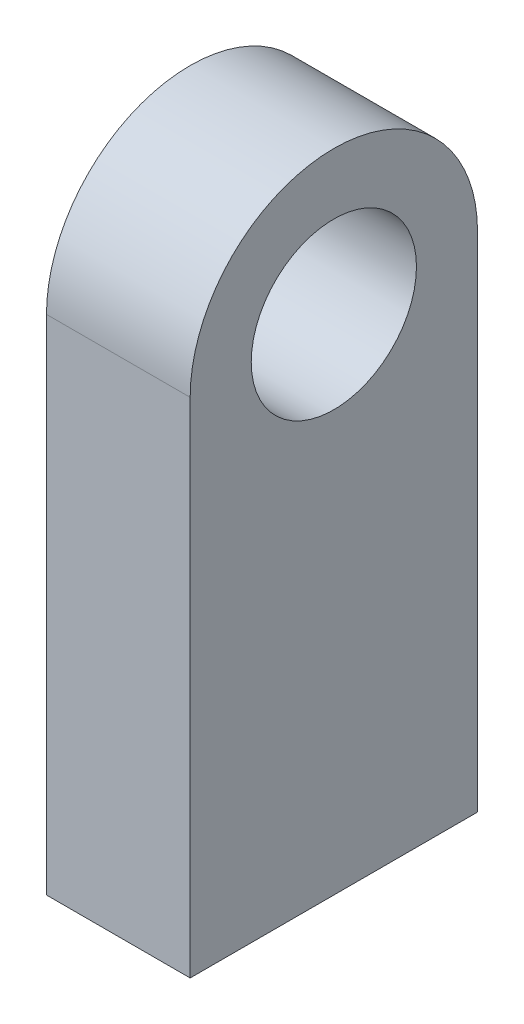
ISO-10303-21;
HEADER;
FILE_DESCRIPTION(('STEP AP214'),'2;1');
FILE_NAME('part.step','',(''),(''),'','','');
FILE_SCHEMA(('AUTOMOTIVE_DESIGN { 1 0 10303 214 1 1 1 1 }'));
ENDSEC;
DATA;
#1=APPLICATION_CONTEXT('core data for automotive mechanical design processes');
#2=APPLICATION_PROTOCOL_DEFINITION('international standard','automotive_design',2000,#1);
#3=PRODUCT_CONTEXT('',#1,'mechanical');
#4=PRODUCT('Part','Part','',(#3));
#5=PRODUCT_RELATED_PRODUCT_CATEGORY('part','',(#4));
#6=PRODUCT_DEFINITION_FORMATION('','',#4);
#7=PRODUCT_DEFINITION_CONTEXT('part definition',#1,'design');
#8=PRODUCT_DEFINITION('design','',#6,#7);
#9=PRODUCT_DEFINITION_SHAPE('','',#8);
#10=(LENGTH_UNIT() NAMED_UNIT(*) SI_UNIT(.MILLI.,.METRE.));
#11=(NAMED_UNIT(*) PLANE_ANGLE_UNIT() SI_UNIT($,.RADIAN.));
#12=(NAMED_UNIT(*) SI_UNIT($,.STERADIAN.) SOLID_ANGLE_UNIT());
#13=UNCERTAINTY_MEASURE_WITH_UNIT(LENGTH_MEASURE(1.E-05),#10,'distance_accuracy_value','');
#14=(GEOMETRIC_REPRESENTATION_CONTEXT(3) GLOBAL_UNCERTAINTY_ASSIGNED_CONTEXT((#13)) GLOBAL_UNIT_ASSIGNED_CONTEXT((#10,
#11,#12)) REPRESENTATION_CONTEXT('',''));
#15=CARTESIAN_POINT('',(0.,0.,0.));
#16=DIRECTION('',(0.,0.,1.));
#17=DIRECTION('',(1.,0.,0.));
#18=AXIS2_PLACEMENT_3D('',#15,#16,#17);
#19=CARTESIAN_POINT('',(20.,35.,0.));
#20=DIRECTION('',(-1.,0.,0.));
#21=DIRECTION('',(0.,0.,1.));
#22=AXIS2_PLACEMENT_3D('',#19,#20,#21);
#23=PLANE('',#22);
#24=DIRECTION('',(0.,1.,0.));
#25=VECTOR('',#24,1.);
#26=CARTESIAN_POINT('',(20.,35.,-20.));
#27=LINE('',#26,#25);
#28=CARTESIAN_POINT('',(20.,-35.,-20.));
#29=VERTEX_POINT('',#28);
#30=CARTESIAN_POINT('',(20.,35.,-20.));
#31=VERTEX_POINT('',#30);
#32=EDGE_CURVE('E89',#29,#31,#27,.T.);
#33=ORIENTED_EDGE('',*,*,#32,.T.);
#34=CARTESIAN_POINT('',(20.,35.,0.));
#35=DIRECTION('',(1.,0.,0.));
#36=DIRECTION('',(0.,0.,1.));
#37=AXIS2_PLACEMENT_3D('',#34,#35,#36);
#38=CIRCLE('',#37,20.);
#39=CARTESIAN_POINT('',(20.,35.,20.));
#40=VERTEX_POINT('',#39);
#41=EDGE_CURVE('E84',#31,#40,#38,.T.);
#42=ORIENTED_EDGE('',*,*,#41,.T.);
#43=DIRECTION('',(0.,-1.,0.));
#44=VECTOR('',#43,1.);
#45=CARTESIAN_POINT('',(20.,35.,20.));
#46=LINE('',#45,#44);
#47=CARTESIAN_POINT('',(20.,-35.,20.));
#48=VERTEX_POINT('',#47);
#49=EDGE_CURVE('E87',#40,#48,#46,.T.);
#50=ORIENTED_EDGE('',*,*,#49,.T.);
#51=DIRECTION('',(0.,0.,-1.));
#52=VECTOR('',#51,1.);
#53=CARTESIAN_POINT('',(20.,-35.,20.));
#54=LINE('',#53,#52);
#55=EDGE_CURVE('E54',#48,#29,#54,.T.);
#56=ORIENTED_EDGE('',*,*,#55,.T.);
#57=EDGE_LOOP('',(#33,#42,#50,#56));
#58=FACE_BOUND('',#57,.T.);
#59=CARTESIAN_POINT('',(20.,35.,0.));
#60=DIRECTION('',(1.,0.,0.));
#61=DIRECTION('',(0.,0.,-1.));
#62=AXIS2_PLACEMENT_3D('',#59,#60,#61);
#63=CIRCLE('',#62,11.5);
#64=CARTESIAN_POINT('',(20.,35.,-11.5));
#65=VERTEX_POINT('',#64);
#66=EDGE_CURVE('E104',#65,#65,#63,.T.);
#67=ORIENTED_EDGE('',*,*,#66,.F.);
#68=EDGE_LOOP('',(#67));
#69=FACE_BOUND('',#68,.T.);
#70=ADVANCED_FACE('F37',(#58,#69),#23,.F.);
#71=CARTESIAN_POINT('',(0.,35.,0.));
#72=DIRECTION('',(-1.,0.,0.));
#73=DIRECTION('',(0.,0.,1.));
#74=AXIS2_PLACEMENT_3D('',#71,#72,#73);
#75=PLANE('',#74);
#76=DIRECTION('',(0.,1.,0.));
#77=VECTOR('',#76,1.);
#78=CARTESIAN_POINT('',(0.,35.,-20.));
#79=LINE('',#78,#77);
#80=CARTESIAN_POINT('',(0.,-35.,-20.));
#81=VERTEX_POINT('',#80);
#82=CARTESIAN_POINT('',(0.,35.,-20.));
#83=VERTEX_POINT('',#82);
#84=EDGE_CURVE('E101',#81,#83,#79,.T.);
#85=ORIENTED_EDGE('',*,*,#84,.F.);
#86=DIRECTION('',(0.,0.,-1.));
#87=VECTOR('',#86,1.);
#88=CARTESIAN_POINT('',(0.,-35.,20.));
#89=LINE('',#88,#87);
#90=CARTESIAN_POINT('',(0.,-35.,20.));
#91=VERTEX_POINT('',#90);
#92=EDGE_CURVE('E77',#91,#81,#89,.T.);
#93=ORIENTED_EDGE('',*,*,#92,.F.);
#94=DIRECTION('',(0.,-1.,0.));
#95=VECTOR('',#94,1.);
#96=CARTESIAN_POINT('',(0.,35.,20.));
#97=LINE('',#96,#95);
#98=CARTESIAN_POINT('',(0.,35.,20.));
#99=VERTEX_POINT('',#98);
#100=EDGE_CURVE('E71',#99,#91,#97,.T.);
#101=ORIENTED_EDGE('',*,*,#100,.F.);
#102=CARTESIAN_POINT('',(0.,35.,0.));
#103=DIRECTION('',(1.,0.,0.));
#104=DIRECTION('',(0.,0.,1.));
#105=AXIS2_PLACEMENT_3D('',#102,#103,#104);
#106=CIRCLE('',#105,20.);
#107=EDGE_CURVE('E93',#83,#99,#106,.T.);
#108=ORIENTED_EDGE('',*,*,#107,.F.);
#109=EDGE_LOOP('',(#85,#93,#101,#108));
#110=FACE_BOUND('',#109,.T.);
#111=CARTESIAN_POINT('',(0.,35.,0.));
#112=DIRECTION('',(1.,0.,0.));
#113=DIRECTION('',(0.,0.,-1.));
#114=AXIS2_PLACEMENT_3D('',#111,#112,#113);
#115=CIRCLE('',#114,11.5);
#116=CARTESIAN_POINT('',(0.,35.,-11.5));
#117=VERTEX_POINT('',#116);
#118=EDGE_CURVE('E116',#117,#117,#115,.T.);
#119=ORIENTED_EDGE('',*,*,#118,.T.);
#120=EDGE_LOOP('',(#119));
#121=FACE_BOUND('',#120,.T.);
#122=ADVANCED_FACE('F112',(#110,#121),#75,.T.);
#123=CARTESIAN_POINT('',(20.,35.,-20.));
#124=DIRECTION('',(0.,0.,1.));
#125=DIRECTION('',(0.,-1.,0.));
#126=AXIS2_PLACEMENT_3D('',#123,#124,#125);
#127=PLANE('',#126);
#128=ORIENTED_EDGE('',*,*,#84,.T.);
#129=DIRECTION('',(-1.,0.,0.));
#130=VECTOR('',#129,1.);
#131=CARTESIAN_POINT('',(20.,35.,-20.));
#132=LINE('',#131,#130);
#133=EDGE_CURVE('E11',#31,#83,#132,.T.);
#134=ORIENTED_EDGE('',*,*,#133,.F.);
#135=ORIENTED_EDGE('',*,*,#32,.F.);
#136=DIRECTION('',(-1.,0.,0.));
#137=VECTOR('',#136,1.);
#138=CARTESIAN_POINT('',(20.,-35.,-20.));
#139=LINE('',#138,#137);
#140=EDGE_CURVE('E97',#29,#81,#139,.T.);
#141=ORIENTED_EDGE('',*,*,#140,.T.);
#142=EDGE_LOOP('',(#128,#134,#135,#141));
#143=FACE_BOUND('',#142,.T.);
#144=ADVANCED_FACE('F39',(#143),#127,.F.);
#145=CARTESIAN_POINT('',(20.,35.,0.));
#146=DIRECTION('',(-1.,0.,0.));
#147=DIRECTION('',(0.,0.,1.));
#148=AXIS2_PLACEMENT_3D('',#145,#146,#147);
#149=CYLINDRICAL_SURFACE('',#148,20.);
#150=ORIENTED_EDGE('',*,*,#107,.T.);
#151=DIRECTION('',(-1.,0.,0.));
#152=VECTOR('',#151,1.);
#153=CARTESIAN_POINT('',(20.,35.,20.));
#154=LINE('',#153,#152);
#155=EDGE_CURVE('E46',#40,#99,#154,.T.);
#156=ORIENTED_EDGE('',*,*,#155,.F.);
#157=ORIENTED_EDGE('',*,*,#41,.F.);
#158=ORIENTED_EDGE('',*,*,#133,.T.);
#159=EDGE_LOOP('',(#150,#156,#157,#158));
#160=FACE_BOUND('',#159,.T.);
#161=ADVANCED_FACE('F92',(#160),#149,.T.);
#162=CARTESIAN_POINT('',(20.,35.,20.));
#163=DIRECTION('',(0.,0.,-1.));
#164=DIRECTION('',(0.,1.,0.));
#165=AXIS2_PLACEMENT_3D('',#162,#163,#164);
#166=PLANE('',#165);
#167=ORIENTED_EDGE('',*,*,#100,.T.);
#168=DIRECTION('',(-1.,0.,0.));
#169=VECTOR('',#168,1.);
#170=CARTESIAN_POINT('',(20.,-35.,20.));
#171=LINE('',#170,#169);
#172=EDGE_CURVE('E94',#48,#91,#171,.T.);
#173=ORIENTED_EDGE('',*,*,#172,.F.);
#174=ORIENTED_EDGE('',*,*,#49,.F.);
#175=ORIENTED_EDGE('',*,*,#155,.T.);
#176=EDGE_LOOP('',(#167,#173,#174,#175));
#177=FACE_BOUND('',#176,.T.);
#178=ADVANCED_FACE('F95',(#177),#166,.F.);
#179=CARTESIAN_POINT('',(20.,-35.,20.));
#180=DIRECTION('',(0.,1.,0.));
#181=DIRECTION('',(0.,0.,1.));
#182=AXIS2_PLACEMENT_3D('',#179,#180,#181);
#183=PLANE('',#182);
#184=ORIENTED_EDGE('',*,*,#92,.T.);
#185=ORIENTED_EDGE('',*,*,#140,.F.);
#186=ORIENTED_EDGE('',*,*,#55,.F.);
#187=ORIENTED_EDGE('',*,*,#172,.T.);
#188=EDGE_LOOP('',(#184,#185,#186,#187));
#189=FACE_BOUND('',#188,.T.);
#190=ADVANCED_FACE('F109',(#189),#183,.F.);
#191=CARTESIAN_POINT('',(20.,35.,0.));
#192=DIRECTION('',(-1.,0.,0.));
#193=DIRECTION('',(0.,0.,1.));
#194=AXIS2_PLACEMENT_3D('',#191,#192,#193);
#195=CYLINDRICAL_SURFACE('',#194,11.5);
#196=ORIENTED_EDGE('',*,*,#66,.T.);
#197=EDGE_LOOP('',(#196));
#198=FACE_BOUND('',#197,.T.);
#199=ORIENTED_EDGE('',*,*,#118,.F.);
#200=EDGE_LOOP('',(#199));
#201=FACE_BOUND('',#200,.T.);
#202=ADVANCED_FACE('F122',(#198,#201),#195,.F.);
#203=CLOSED_SHELL('',(#70,#122,#144,#161,#178,#190,#202));
#204=MANIFOLD_SOLID_BREP('B2',#203);
#205=ADVANCED_BREP_SHAPE_REPRESENTATION('',(#18,#204),#14);
#206=SHAPE_DEFINITION_REPRESENTATION(#9,#205);
ENDSEC;
END-ISO-10303-21;
